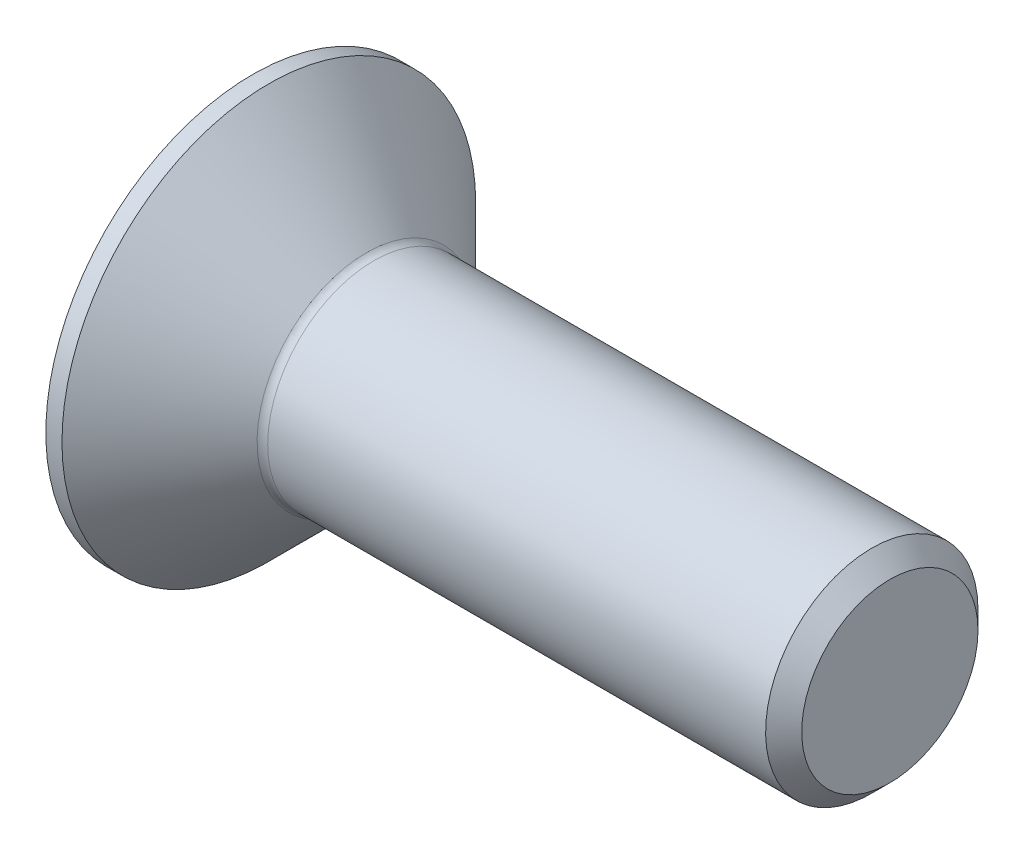
ISO-10303-21;
HEADER;
FILE_DESCRIPTION(('STEP AP214'),'2;1');
FILE_NAME('part.step','',(''),(''),'','','');
FILE_SCHEMA(('AUTOMOTIVE_DESIGN { 1 0 10303 214 1 1 1 1 }'));
ENDSEC;
DATA;
#1=APPLICATION_CONTEXT('core data for automotive mechanical design processes');
#2=APPLICATION_PROTOCOL_DEFINITION('international standard','automotive_design',2000,#1);
#3=PRODUCT_CONTEXT('',#1,'mechanical');
#4=PRODUCT('Part','Part','',(#3));
#5=PRODUCT_RELATED_PRODUCT_CATEGORY('part','',(#4));
#6=PRODUCT_DEFINITION_FORMATION('','',#4);
#7=PRODUCT_DEFINITION_CONTEXT('part definition',#1,'design');
#8=PRODUCT_DEFINITION('design','',#6,#7);
#9=PRODUCT_DEFINITION_SHAPE('','',#8);
#10=(LENGTH_UNIT() NAMED_UNIT(*) SI_UNIT(.MILLI.,.METRE.));
#11=(NAMED_UNIT(*) PLANE_ANGLE_UNIT() SI_UNIT($,.RADIAN.));
#12=(NAMED_UNIT(*) SI_UNIT($,.STERADIAN.) SOLID_ANGLE_UNIT());
#13=UNCERTAINTY_MEASURE_WITH_UNIT(LENGTH_MEASURE(1.E-05),#10,'distance_accuracy_value','');
#14=(GEOMETRIC_REPRESENTATION_CONTEXT(3) GLOBAL_UNCERTAINTY_ASSIGNED_CONTEXT((#13)) GLOBAL_UNIT_ASSIGNED_CONTEXT((#10,
#11,#12)) REPRESENTATION_CONTEXT('',''));
#15=CARTESIAN_POINT('',(0.,0.,0.));
#16=DIRECTION('',(0.,0.,1.));
#17=DIRECTION('',(1.,0.,0.));
#18=AXIS2_PLACEMENT_3D('',#15,#16,#17);
#19=CARTESIAN_POINT('',(4.4,-1.73782431,-3.01));
#20=DIRECTION('',(1.,0.,0.));
#21=DIRECTION('',(0.,1.,0.));
#22=AXIS2_PLACEMENT_3D('',#19,#20,#21);
#23=PLANE('',#22);
#24=DIRECTION('',(0.,0.500000000159516,-0.866025403692342));
#25=VECTOR('',#24,1.);
#26=CARTESIAN_POINT('',(4.4,-3.475648621,0.));
#27=LINE('',#26,#25);
#28=CARTESIAN_POINT('',(4.4,-3.47564862070705,-1.69132809577896E-10));
#29=VERTEX_POINT('',#28);
#30=CARTESIAN_POINT('',(4.4,-1.73782431029295,-3.01000000016913));
#31=VERTEX_POINT('',#30);
#32=EDGE_CURVE('E206',#29,#31,#27,.T.);
#33=ORIENTED_EDGE('',*,*,#32,.F.);
#34=DIRECTION('',(0.,-0.500000000159516,-0.866025403692342));
#35=VECTOR('',#34,1.);
#36=CARTESIAN_POINT('',(4.4,-1.73782431,3.01));
#37=LINE('',#36,#35);
#38=CARTESIAN_POINT('',(4.4,-1.73782431,3.01));
#39=VERTEX_POINT('',#38);
#40=EDGE_CURVE('E11',#39,#29,#37,.T.);
#41=ORIENTED_EDGE('',*,*,#40,.F.);
#42=DIRECTION('',(0.,-1.,0.));
#43=VECTOR('',#42,1.);
#44=CARTESIAN_POINT('',(4.4,1.73782431,3.01));
#45=LINE('',#44,#43);
#46=CARTESIAN_POINT('',(4.4,1.73782431029295,3.01000000016913));
#47=VERTEX_POINT('',#46);
#48=EDGE_CURVE('E42',#47,#39,#45,.T.);
#49=ORIENTED_EDGE('',*,*,#48,.F.);
#50=DIRECTION('',(0.,-0.500000000159516,0.866025403692342));
#51=VECTOR('',#50,1.);
#52=CARTESIAN_POINT('',(4.4,3.475648621,0.));
#53=LINE('',#52,#51);
#54=CARTESIAN_POINT('',(4.4,3.47564862070705,1.69132809577896E-10));
#55=VERTEX_POINT('',#54);
#56=EDGE_CURVE('E188',#55,#47,#53,.T.);
#57=ORIENTED_EDGE('',*,*,#56,.F.);
#58=DIRECTION('',(0.,0.500000000159516,0.866025403692342));
#59=VECTOR('',#58,1.);
#60=CARTESIAN_POINT('',(4.4,1.73782431,-3.01));
#61=LINE('',#60,#59);
#62=CARTESIAN_POINT('',(4.4,1.73782431,-3.01));
#63=VERTEX_POINT('',#62);
#64=EDGE_CURVE('E220',#63,#55,#61,.T.);
#65=ORIENTED_EDGE('',*,*,#64,.F.);
#66=DIRECTION('',(0.,1.,0.));
#67=VECTOR('',#66,1.);
#68=CARTESIAN_POINT('',(4.4,-1.73782431,-3.01));
#69=LINE('',#68,#67);
#70=EDGE_CURVE('E213',#31,#63,#69,.T.);
#71=ORIENTED_EDGE('',*,*,#70,.F.);
#72=EDGE_LOOP('',(#33,#41,#49,#57,#65,#71));
#73=FACE_BOUND('',#72,.T.);
#74=ADVANCED_FACE('F17',(#73),#23,.F.);
#75=CARTESIAN_POINT('',(4.4,-1.73782431,3.01));
#76=DIRECTION('',(0.,0.866025403838329,-0.499999999906659));
#77=DIRECTION('',(-1.,0.,0.));
#78=AXIS2_PLACEMENT_3D('',#75,#76,#77);
#79=PLANE('',#78);
#80=DIRECTION('',(0.,-0.500000000159516,-0.866025403692342));
#81=VECTOR('',#80,1.);
#82=CARTESIAN_POINT('',(0.,-1.73782431,3.01));
#83=LINE('',#82,#81);
#84=CARTESIAN_POINT('',(0.,-1.73782431,3.01));
#85=VERTEX_POINT('',#84);
#86=CARTESIAN_POINT('',(0.,-3.47564862070705,-1.69132809577896E-10));
#87=VERTEX_POINT('',#86);
#88=EDGE_CURVE('E154',#85,#87,#83,.T.);
#89=ORIENTED_EDGE('',*,*,#88,.F.);
#90=DIRECTION('',(-1.,0.,0.));
#91=VECTOR('',#90,1.);
#92=CARTESIAN_POINT('',(4.4,-1.73782431,3.01));
#93=LINE('',#92,#91);
#94=EDGE_CURVE('E25',#39,#85,#93,.T.);
#95=ORIENTED_EDGE('',*,*,#94,.F.);
#96=ORIENTED_EDGE('',*,*,#40,.T.);
#97=DIRECTION('',(-1.,0.,0.));
#98=VECTOR('',#97,1.);
#99=CARTESIAN_POINT('',(4.4,-3.475648621,0.));
#100=LINE('',#99,#98);
#101=EDGE_CURVE('E205',#29,#87,#100,.T.);
#102=ORIENTED_EDGE('',*,*,#101,.T.);
#103=EDGE_LOOP('',(#89,#95,#96,#102));
#104=FACE_BOUND('',#103,.T.);
#105=ADVANCED_FACE('F240',(#104),#79,.T.);
#106=CARTESIAN_POINT('',(4.4,1.73782431,3.01));
#107=DIRECTION('',(0.,0.,-1.));
#108=DIRECTION('',(0.,-1.,0.));
#109=AXIS2_PLACEMENT_3D('',#106,#107,#108);
#110=PLANE('',#109);
#111=DIRECTION('',(0.,-1.,0.));
#112=VECTOR('',#111,1.);
#113=CARTESIAN_POINT('',(0.,1.73782431,3.01));
#114=LINE('',#113,#112);
#115=CARTESIAN_POINT('',(0.,1.73782431029295,3.01000000016913));
#116=VERTEX_POINT('',#115);
#117=EDGE_CURVE('E201',#116,#85,#114,.T.);
#118=ORIENTED_EDGE('',*,*,#117,.F.);
#119=DIRECTION('',(-1.,0.,0.));
#120=VECTOR('',#119,1.);
#121=CARTESIAN_POINT('',(4.4,1.73782431,3.01));
#122=LINE('',#121,#120);
#123=EDGE_CURVE('E192',#47,#116,#122,.T.);
#124=ORIENTED_EDGE('',*,*,#123,.F.);
#125=ORIENTED_EDGE('',*,*,#48,.T.);
#126=ORIENTED_EDGE('',*,*,#94,.T.);
#127=EDGE_LOOP('',(#118,#124,#125,#126));
#128=FACE_BOUND('',#127,.T.);
#129=ADVANCED_FACE('F233',(#128),#110,.T.);
#130=CARTESIAN_POINT('',(4.4,3.475648621,0.));
#131=DIRECTION('',(0.,-0.866025403838329,-0.499999999906659));
#132=DIRECTION('',(0.,0.499999999906659,-0.866025403838329));
#133=AXIS2_PLACEMENT_3D('',#130,#131,#132);
#134=PLANE('',#133);
#135=DIRECTION('',(0.,-0.500000000159516,0.866025403692342));
#136=VECTOR('',#135,1.);
#137=CARTESIAN_POINT('',(0.,3.475648621,0.));
#138=LINE('',#137,#136);
#139=CARTESIAN_POINT('',(0.,3.47564862070705,1.69132809577896E-10));
#140=VERTEX_POINT('',#139);
#141=EDGE_CURVE('E197',#140,#116,#138,.T.);
#142=ORIENTED_EDGE('',*,*,#141,.F.);
#143=DIRECTION('',(-1.,0.,0.));
#144=VECTOR('',#143,1.);
#145=CARTESIAN_POINT('',(4.4,3.475648621,0.));
#146=LINE('',#145,#144);
#147=EDGE_CURVE('E193',#55,#140,#146,.T.);
#148=ORIENTED_EDGE('',*,*,#147,.F.);
#149=ORIENTED_EDGE('',*,*,#56,.T.);
#150=ORIENTED_EDGE('',*,*,#123,.T.);
#151=EDGE_LOOP('',(#142,#148,#149,#150));
#152=FACE_BOUND('',#151,.T.);
#153=ADVANCED_FACE('F256',(#152),#134,.T.);
#154=CARTESIAN_POINT('',(4.4,1.73782431,-3.01));
#155=DIRECTION('',(0.,-0.866025403838329,0.499999999906659));
#156=DIRECTION('',(-1.,0.,0.));
#157=AXIS2_PLACEMENT_3D('',#154,#155,#156);
#158=PLANE('',#157);
#159=DIRECTION('',(0.,0.500000000159516,0.866025403692342));
#160=VECTOR('',#159,1.);
#161=CARTESIAN_POINT('',(0.,1.73782431,-3.01));
#162=LINE('',#161,#160);
#163=CARTESIAN_POINT('',(0.,1.73782431,-3.01));
#164=VERTEX_POINT('',#163);
#165=EDGE_CURVE('E187',#164,#140,#162,.T.);
#166=ORIENTED_EDGE('',*,*,#165,.F.);
#167=DIRECTION('',(-1.,0.,0.));
#168=VECTOR('',#167,1.);
#169=CARTESIAN_POINT('',(4.4,1.73782431,-3.01));
#170=LINE('',#169,#168);
#171=EDGE_CURVE('E217',#63,#164,#170,.T.);
#172=ORIENTED_EDGE('',*,*,#171,.F.);
#173=ORIENTED_EDGE('',*,*,#64,.T.);
#174=ORIENTED_EDGE('',*,*,#147,.T.);
#175=EDGE_LOOP('',(#166,#172,#173,#174));
#176=FACE_BOUND('',#175,.T.);
#177=ADVANCED_FACE('F253',(#176),#158,.T.);
#178=CARTESIAN_POINT('',(4.4,-1.73782431,-3.01));
#179=DIRECTION('',(0.,0.,1.));
#180=DIRECTION('',(1.,0.,0.));
#181=AXIS2_PLACEMENT_3D('',#178,#179,#180);
#182=PLANE('',#181);
#183=DIRECTION('',(0.,1.,0.));
#184=VECTOR('',#183,1.);
#185=CARTESIAN_POINT('',(0.,-1.73782431,-3.01));
#186=LINE('',#185,#184);
#187=CARTESIAN_POINT('',(0.,-1.73782431029295,-3.01000000016913));
#188=VERTEX_POINT('',#187);
#189=EDGE_CURVE('E183',#188,#164,#186,.T.);
#190=ORIENTED_EDGE('',*,*,#189,.F.);
#191=DIRECTION('',(-1.,0.,0.));
#192=VECTOR('',#191,1.);
#193=CARTESIAN_POINT('',(4.4,-1.73782431,-3.01));
#194=LINE('',#193,#192);
#195=EDGE_CURVE('E210',#31,#188,#194,.T.);
#196=ORIENTED_EDGE('',*,*,#195,.F.);
#197=ORIENTED_EDGE('',*,*,#70,.T.);
#198=ORIENTED_EDGE('',*,*,#171,.T.);
#199=EDGE_LOOP('',(#190,#196,#197,#198));
#200=FACE_BOUND('',#199,.T.);
#201=ADVANCED_FACE('F250',(#200),#182,.T.);
#202=CARTESIAN_POINT('',(4.4,-3.475648621,0.));
#203=DIRECTION('',(0.,0.866025403838329,0.499999999906659));
#204=DIRECTION('',(1.,0.,0.));
#205=AXIS2_PLACEMENT_3D('',#202,#203,#204);
#206=PLANE('',#205);
#207=DIRECTION('',(0.,0.500000000159516,-0.866025403692342));
#208=VECTOR('',#207,1.);
#209=CARTESIAN_POINT('',(0.,-3.475648621,0.));
#210=LINE('',#209,#208);
#211=EDGE_CURVE('E157',#87,#188,#210,.T.);
#212=ORIENTED_EDGE('',*,*,#211,.F.);
#213=ORIENTED_EDGE('',*,*,#101,.F.);
#214=ORIENTED_EDGE('',*,*,#32,.T.);
#215=ORIENTED_EDGE('',*,*,#195,.T.);
#216=EDGE_LOOP('',(#212,#213,#214,#215));
#217=FACE_BOUND('',#216,.T.);
#218=ADVANCED_FACE('F245',(#217),#206,.T.);
#219=CARTESIAN_POINT('',(30.,5.,0.));
#220=DIRECTION('',(1.,0.,0.));
#221=DIRECTION('',(0.,1.,0.));
#222=AXIS2_PLACEMENT_3D('',#219,#220,#221);
#223=PLANE('',#222);
#224=CARTESIAN_POINT('',(30.,0.,0.));
#225=DIRECTION('',(1.,0.,0.));
#226=DIRECTION('',(0.,0.,-1.));
#227=AXIS2_PLACEMENT_3D('',#224,#225,#226);
#228=CIRCLE('',#227,4.15);
#229=CARTESIAN_POINT('',(30.,-2.43930879701376,-3.35742052665604));
#230=VERTEX_POINT('',#229);
#231=EDGE_CURVE('E301',#230,#230,#228,.T.);
#232=ORIENTED_EDGE('',*,*,#231,.T.);
#233=EDGE_LOOP('',(#232));
#234=FACE_BOUND('',#233,.T.);
#235=ADVANCED_FACE('F271',(#234),#223,.T.);
#236=CARTESIAN_POINT('',(0.,0.,0.));
#237=DIRECTION('',(-1.,0.,0.));
#238=DIRECTION('',(0.,0.,1.));
#239=AXIS2_PLACEMENT_3D('',#236,#237,#238);
#240=PLANE('',#239);
#241=ORIENTED_EDGE('',*,*,#88,.T.);
#242=ORIENTED_EDGE('',*,*,#211,.T.);
#243=ORIENTED_EDGE('',*,*,#189,.T.);
#244=ORIENTED_EDGE('',*,*,#165,.T.);
#245=ORIENTED_EDGE('',*,*,#141,.T.);
#246=ORIENTED_EDGE('',*,*,#117,.T.);
#247=EDGE_LOOP('',(#241,#242,#243,#244,#245,#246));
#248=FACE_BOUND('',#247,.T.);
#249=CARTESIAN_POINT('',(0.,0.,0.));
#250=DIRECTION('',(-1.,0.,0.));
#251=DIRECTION('',(0.,0.,1.));
#252=AXIS2_PLACEMENT_3D('',#249,#250,#251);
#253=CIRCLE('',#252,9.74);
#254=CARTESIAN_POINT('',(0.,0.,-9.74));
#255=VERTEX_POINT('',#254);
#256=EDGE_CURVE('E159',#255,#255,#253,.T.);
#257=ORIENTED_EDGE('',*,*,#256,.T.);
#258=EDGE_LOOP('',(#257));
#259=FACE_BOUND('',#258,.T.);
#260=ADVANCED_FACE('F237',(#248,#259),#240,.T.);
#261=CARTESIAN_POINT('',(0.38,0.,0.));
#262=DIRECTION('',(-1.,0.,0.));
#263=DIRECTION('',(0.,0.,1.));
#264=AXIS2_PLACEMENT_3D('',#261,#262,#263);
#265=CYLINDRICAL_SURFACE('',#264,9.74);
#266=ORIENTED_EDGE('',*,*,#256,.F.);
#267=DIRECTION('',(1.,0.,0.));
#268=VECTOR('',#267,1.);
#269=CARTESIAN_POINT('',(0.38,0.,-9.74));
#270=LINE('',#269,#268);
#271=CARTESIAN_POINT('',(0.760000000000047,0.,-9.74));
#272=VERTEX_POINT('',#271);
#273=EDGE_CURVE('E158',#255,#272,#270,.T.);
#274=ORIENTED_EDGE('',*,*,#273,.T.);
#275=CARTESIAN_POINT('',(0.760000000000046,0.,0.));
#276=DIRECTION('',(-1.,0.,0.));
#277=DIRECTION('',(0.,0.,1.));
#278=AXIS2_PLACEMENT_3D('',#275,#276,#277);
#279=CIRCLE('',#278,9.74);
#280=CARTESIAN_POINT('',(0.760000000000023,-5.72502835732871,-7.87982552521201));
#281=VERTEX_POINT('',#280);
#282=EDGE_CURVE('E169',#272,#281,#279,.T.);
#283=ORIENTED_EDGE('',*,*,#282,.T.);
#284=CARTESIAN_POINT('',(0.760000000000046,0.,0.));
#285=DIRECTION('',(-1.,0.,0.));
#286=DIRECTION('',(0.,0.,1.));
#287=AXIS2_PLACEMENT_3D('',#284,#285,#286);
#288=CIRCLE('',#287,9.74);
#289=EDGE_CURVE('E163',#281,#272,#288,.T.);
#290=ORIENTED_EDGE('',*,*,#289,.T.);
#291=ORIENTED_EDGE('',*,*,#273,.F.);
#292=EDGE_LOOP('',(#266,#274,#283,#290,#291));
#293=FACE_BOUND('',#292,.T.);
#294=ADVANCED_FACE('F279',(#293),#265,.T.);
#295=CARTESIAN_POINT('',(1.21935533910005,0.,0.));
#296=DIRECTION('',(-1.,0.,0.));
#297=DIRECTION('',(0.,0.587785252292473,0.809016994374947));
#298=AXIS2_PLACEMENT_3D('',#295,#296,#297);
#299=CONICAL_SURFACE('',#298,9.2806446609,0.785398163397448);
#300=CARTESIAN_POINT('',(5.35355339059327,0.,-4.06729094848401E-10));
#301=DIRECTION('',(-1.,0.,0.));
#302=DIRECTION('',(0.,0.,-1.));
#303=AXIS2_PLACEMENT_3D('',#300,#301,#302);
#304=CIRCLE('',#303,5.146446609);
#305=CARTESIAN_POINT('',(5.35355339100002,-3.02500541848082,-4.16356276732434));
#306=VERTEX_POINT('',#305);
#307=CARTESIAN_POINT('',(5.35355339059327,0.,-5.14644660940673));
#308=VERTEX_POINT('',#307);
#309=EDGE_CURVE('E141',#306,#308,#304,.T.);
#310=ORIENTED_EDGE('',*,*,#309,.T.);
#311=CARTESIAN_POINT('',(5.35355339059327,0.,-4.06729094848401E-10));
#312=DIRECTION('',(-1.,0.,0.));
#313=DIRECTION('',(0.,0.,-1.));
#314=AXIS2_PLACEMENT_3D('',#311,#312,#313);
#315=CIRCLE('',#314,5.146446609);
#316=EDGE_CURVE('E131',#308,#306,#315,.T.);
#317=ORIENTED_EDGE('',*,*,#316,.T.);
#318=DIRECTION('',(-0.707106781186548,-0.415626937777453,-0.572061402817684));
#319=VECTOR('',#318,1.);
#320=CARTESIAN_POINT('',(1.21935533910005,-5.4550260634439,-7.50819924942322));
#321=LINE('',#320,#319);
#322=EDGE_CURVE('E130',#306,#281,#321,.T.);
#323=ORIENTED_EDGE('',*,*,#322,.T.);
#324=ORIENTED_EDGE('',*,*,#282,.F.);
#325=ORIENTED_EDGE('',*,*,#289,.F.);
#326=ORIENTED_EDGE('',*,*,#322,.F.);
#327=EDGE_LOOP('',(#310,#317,#323,#324,#325,#326));
#328=FACE_BOUND('',#327,.T.);
#329=ADVANCED_FACE('F284',(#328),#299,.T.);
#330=CARTESIAN_POINT('',(17.4285533905,0.,0.));
#331=DIRECTION('',(-1.,0.,0.));
#332=DIRECTION('',(0.,0.,1.));
#333=AXIS2_PLACEMENT_3D('',#330,#331,#332);
#334=CYLINDRICAL_SURFACE('',#333,5.);
#335=CARTESIAN_POINT('',(5.70710678118655,0.,-1.86548554381716E-10));
#336=DIRECTION('',(1.,0.,0.));
#337=DIRECTION('',(0.,0.,1.));
#338=AXIS2_PLACEMENT_3D('',#335,#336,#337);
#339=CIRCLE('',#338,5.);
#340=CARTESIAN_POINT('',(5.70710678118655,0.,-5.00000000018655));
#341=VERTEX_POINT('',#340);
#342=EDGE_CURVE('E125',#341,#341,#339,.T.);
#343=ORIENTED_EDGE('',*,*,#342,.T.);
#344=DIRECTION('',(1.,0.,0.));
#345=VECTOR('',#344,1.);
#346=CARTESIAN_POINT('',(17.4285533905,0.,-5.));
#347=LINE('',#346,#345);
#348=CARTESIAN_POINT('',(29.15,0.,-5.));
#349=VERTEX_POINT('',#348);
#350=EDGE_CURVE('E121',#341,#349,#347,.T.);
#351=ORIENTED_EDGE('',*,*,#350,.T.);
#352=CARTESIAN_POINT('',(29.15,0.,0.));
#353=DIRECTION('',(-1.,0.,0.));
#354=DIRECTION('',(0.,0.,1.));
#355=AXIS2_PLACEMENT_3D('',#352,#353,#354);
#356=CIRCLE('',#355,5.);
#357=CARTESIAN_POINT('',(29.15,-2.93892626146237,-4.04508497187476));
#358=VERTEX_POINT('',#357);
#359=EDGE_CURVE('E152',#349,#358,#356,.T.);
#360=ORIENTED_EDGE('',*,*,#359,.T.);
#361=CARTESIAN_POINT('',(29.15,0.,0.));
#362=DIRECTION('',(-1.,0.,0.));
#363=DIRECTION('',(0.,0.,1.));
#364=AXIS2_PLACEMENT_3D('',#361,#362,#363);
#365=CIRCLE('',#364,5.);
#366=EDGE_CURVE('E127',#358,#349,#365,.T.);
#367=ORIENTED_EDGE('',*,*,#366,.T.);
#368=ORIENTED_EDGE('',*,*,#350,.F.);
#369=EDGE_LOOP('',(#343,#351,#360,#367,#368));
#370=FACE_BOUND('',#369,.T.);
#371=ADVANCED_FACE('F123',(#370),#334,.T.);
#372=CARTESIAN_POINT('',(5.70710678131845,0.,0.));
#373=DIRECTION('',(-1.,0.,0.));
#374=DIRECTION('',(0.,0.,1.));
#375=AXIS2_PLACEMENT_3D('',#372,#373,#374);
#376=TOROIDAL_SURFACE('',#375,5.50000000013191,0.5);
#377=ORIENTED_EDGE('',*,*,#342,.F.);
#378=CARTESIAN_POINT('',(5.70710678131845,0.,-5.50000000013191));
#379=DIRECTION('',(0.,-1.,0.));
#380=DIRECTION('',(0.,0.,-1.));
#381=AXIS2_PLACEMENT_3D('',#378,#379,#380);
#382=CIRCLE('',#381,0.5);
#383=EDGE_CURVE('E135',#341,#308,#382,.T.);
#384=ORIENTED_EDGE('',*,*,#383,.T.);
#385=ORIENTED_EDGE('',*,*,#309,.F.);
#386=ORIENTED_EDGE('',*,*,#316,.F.);
#387=ORIENTED_EDGE('',*,*,#383,.F.);
#388=EDGE_LOOP('',(#377,#384,#385,#386,#387));
#389=FACE_BOUND('',#388,.T.);
#390=ADVANCED_FACE('F136',(#389),#376,.F.);
#391=CARTESIAN_POINT('',(29.235,0.,0.));
#392=DIRECTION('',(-1.,0.,0.));
#393=DIRECTION('',(0.,0.587785252292472,0.809016994374948));
#394=AXIS2_PLACEMENT_3D('',#391,#392,#393);
#395=CONICAL_SURFACE('',#394,4.915,0.785398163397447);
#396=ORIENTED_EDGE('',*,*,#231,.F.);
#397=DIRECTION('',(-0.707106781186548,-0.415626937777453,-0.572061402817684));
#398=VECTOR('',#397,1.);
#399=CARTESIAN_POINT('',(29.235,-2.88896451501749,-3.97631852735286));
#400=LINE('',#399,#398);
#401=EDGE_CURVE('E302',#230,#358,#400,.T.);
#402=ORIENTED_EDGE('',*,*,#401,.T.);
#403=ORIENTED_EDGE('',*,*,#359,.F.);
#404=ORIENTED_EDGE('',*,*,#366,.F.);
#405=ORIENTED_EDGE('',*,*,#401,.F.);
#406=EDGE_LOOP('',(#396,#402,#403,#404,#405));
#407=FACE_BOUND('',#406,.T.);
#408=ADVANCED_FACE('F293',(#407),#395,.T.);
#409=CLOSED_SHELL('',(#74,#105,#129,#153,#177,#201,#218,#235,#260,#294,#329,#371,#390,#408));
#410=MANIFOLD_SOLID_BREP('B1',#409);
#411=ADVANCED_BREP_SHAPE_REPRESENTATION('',(#18,#410),#14);
#412=SHAPE_DEFINITION_REPRESENTATION(#9,#411);
ENDSEC;
END-ISO-10303-21;
